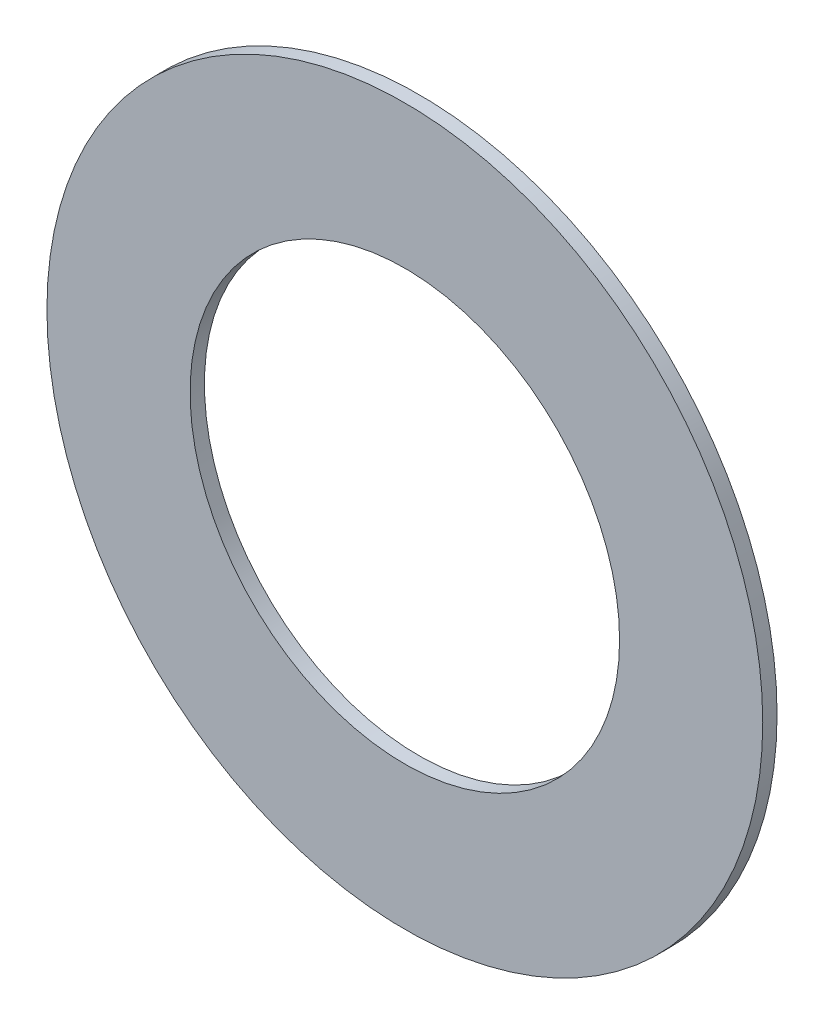
ISO-10303-21;
HEADER;
FILE_DESCRIPTION(('STEP AP214'),'2;1');
FILE_NAME('part.step','',(''),(''),'','','');
FILE_SCHEMA(('AUTOMOTIVE_DESIGN { 1 0 10303 214 1 1 1 1 }'));
ENDSEC;
DATA;
#1=APPLICATION_CONTEXT('core data for automotive mechanical design processes');
#2=APPLICATION_PROTOCOL_DEFINITION('international standard','automotive_design',2000,#1);
#3=PRODUCT_CONTEXT('',#1,'mechanical');
#4=PRODUCT('Part','Part','',(#3));
#5=PRODUCT_RELATED_PRODUCT_CATEGORY('part','',(#4));
#6=PRODUCT_DEFINITION_FORMATION('','',#4);
#7=PRODUCT_DEFINITION_CONTEXT('part definition',#1,'design');
#8=PRODUCT_DEFINITION('design','',#6,#7);
#9=PRODUCT_DEFINITION_SHAPE('','',#8);
#10=(LENGTH_UNIT() NAMED_UNIT(*) SI_UNIT(.MILLI.,.METRE.));
#11=(NAMED_UNIT(*) PLANE_ANGLE_UNIT() SI_UNIT($,.RADIAN.));
#12=(NAMED_UNIT(*) SI_UNIT($,.STERADIAN.) SOLID_ANGLE_UNIT());
#13=UNCERTAINTY_MEASURE_WITH_UNIT(LENGTH_MEASURE(1.E-05),#10,'distance_accuracy_value','');
#14=(GEOMETRIC_REPRESENTATION_CONTEXT(3) GLOBAL_UNCERTAINTY_ASSIGNED_CONTEXT((#13)) GLOBAL_UNIT_ASSIGNED_CONTEXT((#10,
#11,#12)) REPRESENTATION_CONTEXT('',''));
#15=CARTESIAN_POINT('',(0.,0.,0.));
#16=DIRECTION('',(0.,0.,1.));
#17=DIRECTION('',(1.,0.,0.));
#18=AXIS2_PLACEMENT_3D('',#15,#16,#17);
#19=CARTESIAN_POINT('',(0.,0.,0.1));
#20=DIRECTION('',(0.,0.,1.));
#21=DIRECTION('',(1.,0.,0.));
#22=AXIS2_PLACEMENT_3D('',#19,#20,#21);
#23=PLANE('',#22);
#24=CARTESIAN_POINT('',(0.,0.,0.1));
#25=DIRECTION('',(0.,0.,1.));
#26=DIRECTION('',(1.,0.,0.));
#27=AXIS2_PLACEMENT_3D('',#24,#25,#26);
#28=CIRCLE('',#27,2.5);
#29=CARTESIAN_POINT('',(2.5,0.,0.1));
#30=VERTEX_POINT('',#29);
#31=EDGE_CURVE('E10',#30,#30,#28,.T.);
#32=ORIENTED_EDGE('',*,*,#31,.T.);
#33=EDGE_LOOP('',(#32));
#34=FACE_BOUND('',#33,.T.);
#35=CARTESIAN_POINT('',(0.,0.,0.1));
#36=DIRECTION('',(0.,0.,1.));
#37=DIRECTION('',(1.,0.,0.));
#38=AXIS2_PLACEMENT_3D('',#35,#36,#37);
#39=CIRCLE('',#38,1.5);
#40=CARTESIAN_POINT('',(1.5,0.,0.1));
#41=VERTEX_POINT('',#40);
#42=EDGE_CURVE('E50',#41,#41,#39,.T.);
#43=ORIENTED_EDGE('',*,*,#42,.F.);
#44=EDGE_LOOP('',(#43));
#45=FACE_BOUND('',#44,.T.);
#46=ADVANCED_FACE('F39',(#34,#45),#23,.T.);
#47=CARTESIAN_POINT('',(0.,0.,0.));
#48=DIRECTION('',(0.,0.,1.));
#49=DIRECTION('',(1.,0.,0.));
#50=AXIS2_PLACEMENT_3D('',#47,#48,#49);
#51=PLANE('',#50);
#52=CARTESIAN_POINT('',(0.,0.,0.));
#53=DIRECTION('',(0.,0.,1.));
#54=DIRECTION('',(1.,0.,0.));
#55=AXIS2_PLACEMENT_3D('',#52,#53,#54);
#56=CIRCLE('',#55,2.5);
#57=CARTESIAN_POINT('',(2.5,0.,0.));
#58=VERTEX_POINT('',#57);
#59=EDGE_CURVE('E43',#58,#58,#56,.T.);
#60=ORIENTED_EDGE('',*,*,#59,.F.);
#61=EDGE_LOOP('',(#60));
#62=FACE_BOUND('',#61,.T.);
#63=CARTESIAN_POINT('',(0.,0.,0.));
#64=DIRECTION('',(0.,0.,1.));
#65=DIRECTION('',(1.,0.,0.));
#66=AXIS2_PLACEMENT_3D('',#63,#64,#65);
#67=CIRCLE('',#66,1.5);
#68=CARTESIAN_POINT('',(1.5,0.,0.));
#69=VERTEX_POINT('',#68);
#70=EDGE_CURVE('E52',#69,#69,#67,.T.);
#71=ORIENTED_EDGE('',*,*,#70,.T.);
#72=EDGE_LOOP('',(#71));
#73=FACE_BOUND('',#72,.T.);
#74=ADVANCED_FACE('F62',(#62,#73),#51,.F.);
#75=CARTESIAN_POINT('',(0.,0.,0.1));
#76=DIRECTION('',(0.,0.,-1.));
#77=DIRECTION('',(-1.,0.,0.));
#78=AXIS2_PLACEMENT_3D('',#75,#76,#77);
#79=CYLINDRICAL_SURFACE('',#78,2.5);
#80=ORIENTED_EDGE('',*,*,#31,.F.);
#81=EDGE_LOOP('',(#80));
#82=FACE_BOUND('',#81,.T.);
#83=ORIENTED_EDGE('',*,*,#59,.T.);
#84=EDGE_LOOP('',(#83));
#85=FACE_BOUND('',#84,.T.);
#86=ADVANCED_FACE('F41',(#82,#85),#79,.T.);
#87=CARTESIAN_POINT('',(0.,0.,0.1));
#88=DIRECTION('',(0.,0.,-1.));
#89=DIRECTION('',(-1.,0.,0.));
#90=AXIS2_PLACEMENT_3D('',#87,#88,#89);
#91=CYLINDRICAL_SURFACE('',#90,1.5);
#92=ORIENTED_EDGE('',*,*,#42,.T.);
#93=EDGE_LOOP('',(#92));
#94=FACE_BOUND('',#93,.T.);
#95=ORIENTED_EDGE('',*,*,#70,.F.);
#96=EDGE_LOOP('',(#95));
#97=FACE_BOUND('',#96,.T.);
#98=ADVANCED_FACE('F58',(#94,#97),#91,.F.);
#99=CLOSED_SHELL('',(#46,#74,#86,#98));
#100=MANIFOLD_SOLID_BREP('B2',#99);
#101=ADVANCED_BREP_SHAPE_REPRESENTATION('',(#18,#100),#14);
#102=SHAPE_DEFINITION_REPRESENTATION(#9,#101);
ENDSEC;
END-ISO-10303-21;
